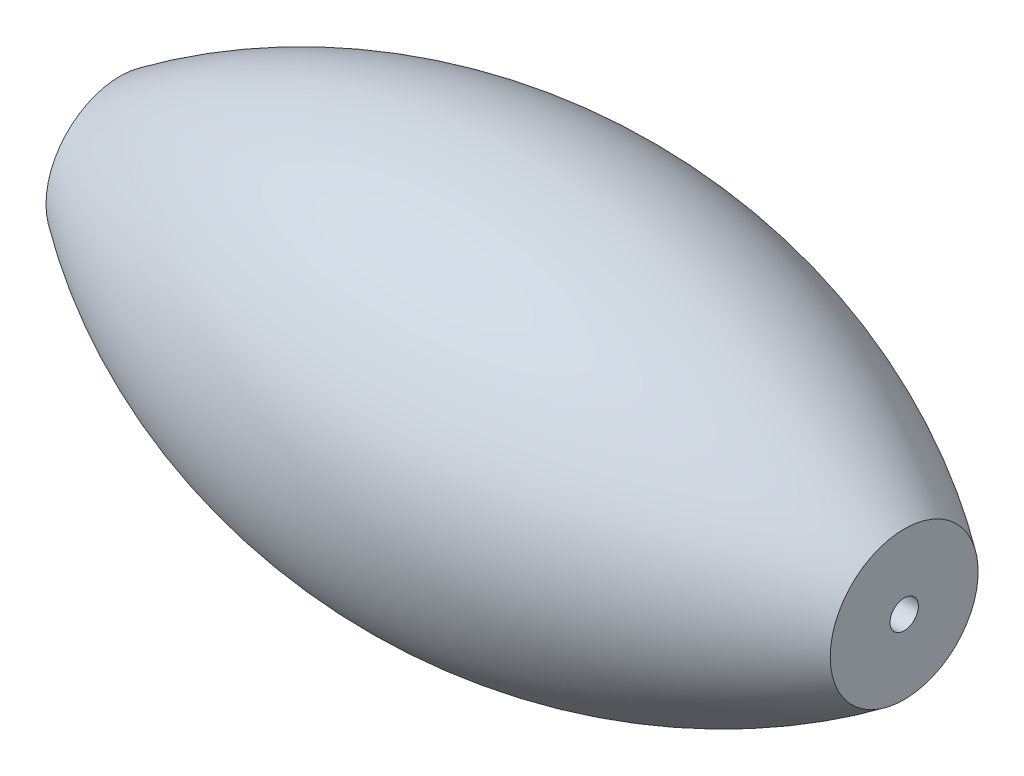
ISO-10303-21;
HEADER;
FILE_DESCRIPTION(('STEP AP214'),'2;1');
FILE_NAME('part.step','',(''),(''),'','','');
FILE_SCHEMA(('AUTOMOTIVE_DESIGN { 1 0 10303 214 1 1 1 1 }'));
ENDSEC;
DATA;
#1=APPLICATION_CONTEXT('core data for automotive mechanical design processes');
#2=APPLICATION_PROTOCOL_DEFINITION('international standard','automotive_design',2000,#1);
#3=PRODUCT_CONTEXT('',#1,'mechanical');
#4=PRODUCT('Part','Part','',(#3));
#5=PRODUCT_RELATED_PRODUCT_CATEGORY('part','',(#4));
#6=PRODUCT_DEFINITION_FORMATION('','',#4);
#7=PRODUCT_DEFINITION_CONTEXT('part definition',#1,'design');
#8=PRODUCT_DEFINITION('design','',#6,#7);
#9=PRODUCT_DEFINITION_SHAPE('','',#8);
#10=(LENGTH_UNIT() NAMED_UNIT(*) SI_UNIT(.MILLI.,.METRE.));
#11=(NAMED_UNIT(*) PLANE_ANGLE_UNIT() SI_UNIT($,.RADIAN.));
#12=(NAMED_UNIT(*) SI_UNIT($,.STERADIAN.) SOLID_ANGLE_UNIT());
#13=UNCERTAINTY_MEASURE_WITH_UNIT(LENGTH_MEASURE(1.E-05),#10,'distance_accuracy_value','');
#14=(GEOMETRIC_REPRESENTATION_CONTEXT(3) GLOBAL_UNCERTAINTY_ASSIGNED_CONTEXT((#13)) GLOBAL_UNIT_ASSIGNED_CONTEXT((#10,
#11,#12)) REPRESENTATION_CONTEXT('',''));
#15=CARTESIAN_POINT('',(0.,0.,0.));
#16=DIRECTION('',(0.,0.,1.));
#17=DIRECTION('',(1.,0.,0.));
#18=AXIS2_PLACEMENT_3D('',#15,#16,#17);
#19=CARTESIAN_POINT('',(0.,74.7944864682939,0.));
#20=DIRECTION('',(-1.,0.,0.));
#21=DIRECTION('',(0.,0.,1.));
#22=AXIS2_PLACEMENT_3D('',#19,#20,#21);
#23=DEGENERATE_TOROIDAL_SURFACE('',#22,74.7944864682939,106.513967662428,.F.);
#24=CARTESIAN_POINT('',(-62.1333944549718,74.7944864682939,0.));
#25=DIRECTION('',(-1.,0.,0.));
#26=DIRECTION('',(0.,0.,1.));
#27=AXIS2_PLACEMENT_3D('',#24,#25,#26);
#28=CIRCLE('',#27,11.7194811941343);
#29=CARTESIAN_POINT('',(-62.1333944549718,74.7944864682939,11.7194811941343));
#30=VERTEX_POINT('',#29);
#31=EDGE_CURVE('E10',#30,#30,#28,.T.);
#32=ORIENTED_EDGE('',*,*,#31,.F.);
#33=EDGE_LOOP('',(#32));
#34=FACE_BOUND('',#33,.T.);
#35=CARTESIAN_POINT('',(62.1333944549718,74.7944864682939,0.));
#36=DIRECTION('',(-1.,0.,0.));
#37=DIRECTION('',(0.,0.,1.));
#38=AXIS2_PLACEMENT_3D('',#35,#36,#37);
#39=CIRCLE('',#38,11.7194811941343);
#40=CARTESIAN_POINT('',(62.1333944549718,74.7944864682939,11.7194811941343));
#41=VERTEX_POINT('',#40);
#42=EDGE_CURVE('E37',#41,#41,#39,.T.);
#43=ORIENTED_EDGE('',*,*,#42,.T.);
#44=EDGE_LOOP('',(#43));
#45=FACE_BOUND('',#44,.T.);
#46=ADVANCED_FACE('F31',(#34,#45),#23,.F.);
#47=CARTESIAN_POINT('',(-62.1333944549718,86.5139676624282,0.));
#48=DIRECTION('',(1.,0.,0.));
#49=DIRECTION('',(0.,0.,-1.));
#50=AXIS2_PLACEMENT_3D('',#47,#48,#49);
#51=PLANE('',#50);
#52=CARTESIAN_POINT('',(-62.1333944549718,74.7944864682939,0.));
#53=DIRECTION('',(1.,0.,0.));
#54=DIRECTION('',(0.,0.,-1.));
#55=AXIS2_PLACEMENT_3D('',#52,#53,#54);
#56=CIRCLE('',#55,2.24789999999998);
#57=CARTESIAN_POINT('',(-62.1333944549718,74.7944864682939,-2.24789999999998));
#58=VERTEX_POINT('',#57);
#59=EDGE_CURVE('E41',#58,#58,#56,.F.);
#60=ORIENTED_EDGE('',*,*,#59,.F.);
#61=EDGE_LOOP('',(#60));
#62=FACE_BOUND('',#61,.T.);
#63=ORIENTED_EDGE('',*,*,#31,.T.);
#64=EDGE_LOOP('',(#63));
#65=FACE_BOUND('',#64,.T.);
#66=ADVANCED_FACE('F56',(#62,#65),#51,.F.);
#67=CARTESIAN_POINT('',(62.1333944549718,74.7944864682939,0.));
#68=DIRECTION('',(-1.,0.,0.));
#69=DIRECTION('',(0.,0.,1.));
#70=AXIS2_PLACEMENT_3D('',#67,#68,#69);
#71=PLANE('',#70);
#72=CARTESIAN_POINT('',(62.1333944549718,74.7944864682939,0.));
#73=DIRECTION('',(1.,0.,0.));
#74=DIRECTION('',(0.,0.,-1.));
#75=AXIS2_PLACEMENT_3D('',#72,#73,#74);
#76=CIRCLE('',#75,2.24789999999998);
#77=CARTESIAN_POINT('',(62.1333944549718,74.7944864682939,-2.24789999999998));
#78=VERTEX_POINT('',#77);
#79=EDGE_CURVE('E45',#78,#78,#76,.T.);
#80=ORIENTED_EDGE('',*,*,#79,.F.);
#81=EDGE_LOOP('',(#80));
#82=FACE_BOUND('',#81,.T.);
#83=ORIENTED_EDGE('',*,*,#42,.F.);
#84=EDGE_LOOP('',(#83));
#85=FACE_BOUND('',#84,.T.);
#86=ADVANCED_FACE('F53',(#82,#85),#71,.F.);
#87=CARTESIAN_POINT('',(62.1333944549718,74.7944864682939,0.));
#88=DIRECTION('',(1.,0.,0.));
#89=DIRECTION('',(0.,0.,-1.));
#90=AXIS2_PLACEMENT_3D('',#87,#88,#89);
#91=CYLINDRICAL_SURFACE('',#90,2.24789999999998);
#92=ORIENTED_EDGE('',*,*,#59,.T.);
#93=EDGE_LOOP('',(#92));
#94=FACE_BOUND('',#93,.T.);
#95=ORIENTED_EDGE('',*,*,#79,.T.);
#96=EDGE_LOOP('',(#95));
#97=FACE_BOUND('',#96,.T.);
#98=ADVANCED_FACE('F51',(#94,#97),#91,.F.);
#99=CLOSED_SHELL('',(#46,#66,#86,#98));
#100=MANIFOLD_SOLID_BREP('B2',#99);
#101=ADVANCED_BREP_SHAPE_REPRESENTATION('',(#18,#100),#14);
#102=SHAPE_DEFINITION_REPRESENTATION(#9,#101);
ENDSEC;
END-ISO-10303-21;
